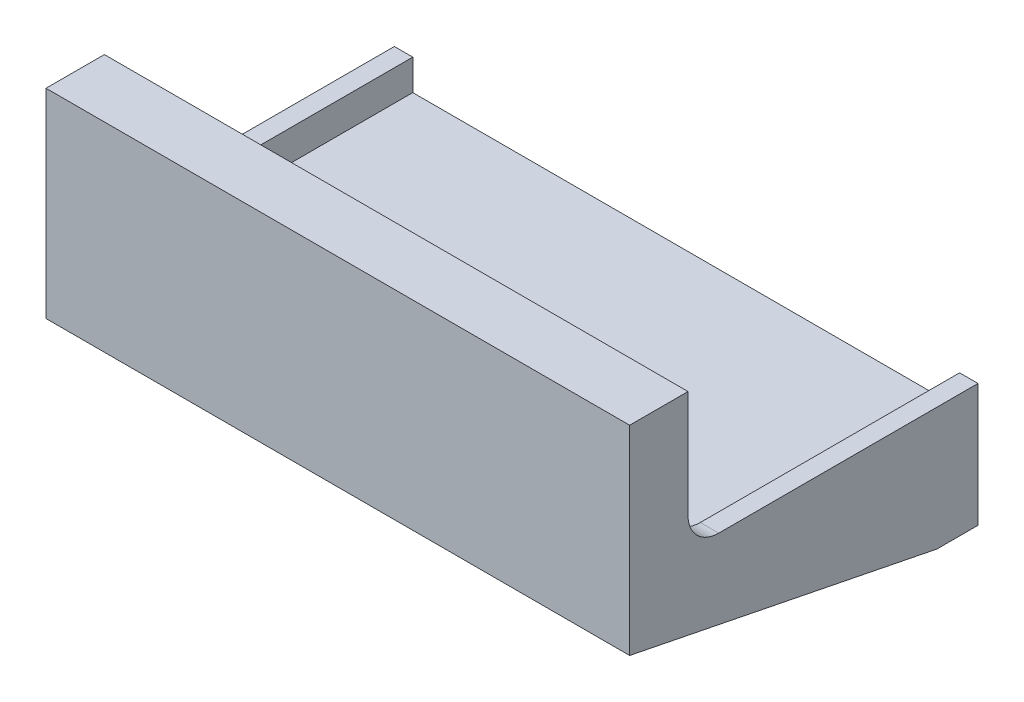
ISO-10303-21;
HEADER;
FILE_DESCRIPTION(('STEP AP214'),'2;1');
FILE_NAME('part.step','',(''),(''),'','','');
FILE_SCHEMA(('AUTOMOTIVE_DESIGN { 1 0 10303 214 1 1 1 1 }'));
ENDSEC;
DATA;
#1=APPLICATION_CONTEXT('core data for automotive mechanical design processes');
#2=APPLICATION_PROTOCOL_DEFINITION('international standard','automotive_design',2000,#1);
#3=PRODUCT_CONTEXT('',#1,'mechanical');
#4=PRODUCT('Part','Part','',(#3));
#5=PRODUCT_RELATED_PRODUCT_CATEGORY('part','',(#4));
#6=PRODUCT_DEFINITION_FORMATION('','',#4);
#7=PRODUCT_DEFINITION_CONTEXT('part definition',#1,'design');
#8=PRODUCT_DEFINITION('design','',#6,#7);
#9=PRODUCT_DEFINITION_SHAPE('','',#8);
#10=(LENGTH_UNIT() NAMED_UNIT(*) SI_UNIT(.MILLI.,.METRE.));
#11=(NAMED_UNIT(*) PLANE_ANGLE_UNIT() SI_UNIT($,.RADIAN.));
#12=(NAMED_UNIT(*) SI_UNIT($,.STERADIAN.) SOLID_ANGLE_UNIT());
#13=UNCERTAINTY_MEASURE_WITH_UNIT(LENGTH_MEASURE(1.E-05),#10,'distance_accuracy_value','');
#14=(GEOMETRIC_REPRESENTATION_CONTEXT(3) GLOBAL_UNCERTAINTY_ASSIGNED_CONTEXT((#13)) GLOBAL_UNIT_ASSIGNED_CONTEXT((#10,
#11,#12)) REPRESENTATION_CONTEXT('',''));
#15=CARTESIAN_POINT('',(0.,0.,0.));
#16=DIRECTION('',(0.,0.,1.));
#17=DIRECTION('',(1.,0.,0.));
#18=AXIS2_PLACEMENT_3D('',#15,#16,#17);
#19=CARTESIAN_POINT('',(-60.5,20.,150.782439194738));
#20=DIRECTION('',(0.,-1.,0.));
#21=DIRECTION('',(0.,0.,-1.));
#22=AXIS2_PLACEMENT_3D('',#19,#20,#21);
#23=PLANE('',#22);
#24=DIRECTION('',(0.,0.,-1.));
#25=VECTOR('',#24,1.);
#26=CARTESIAN_POINT('',(-152.5,20.,150.782439194738));
#27=LINE('',#26,#25);
#28=CARTESIAN_POINT('',(-152.5,20.,42.2));
#29=VERTEX_POINT('',#28);
#30=CARTESIAN_POINT('',(-152.5,20.,0.));
#31=VERTEX_POINT('',#30);
#32=EDGE_CURVE('E252',#29,#31,#27,.T.);
#33=ORIENTED_EDGE('',*,*,#32,.F.);
#34=DIRECTION('',(-1.,0.,0.));
#35=VECTOR('',#34,1.);
#36=CARTESIAN_POINT('',(-60.5,20.,42.2));
#37=LINE('',#36,#35);
#38=CARTESIAN_POINT('',(-149.5,20.,42.2));
#39=VERTEX_POINT('',#38);
#40=EDGE_CURVE('E273',#29,#39,#37,.F.);
#41=ORIENTED_EDGE('',*,*,#40,.T.);
#42=DIRECTION('',(0.,0.,-1.));
#43=VECTOR('',#42,1.);
#44=CARTESIAN_POINT('',(-149.5,20.,150.782439194738));
#45=LINE('',#44,#43);
#46=CARTESIAN_POINT('',(-149.5,20.,0.));
#47=VERTEX_POINT('',#46);
#48=EDGE_CURVE('E254',#39,#47,#45,.T.);
#49=ORIENTED_EDGE('',*,*,#48,.T.);
#50=DIRECTION('',(-1.,0.,0.));
#51=VECTOR('',#50,1.);
#52=CARTESIAN_POINT('',(-152.5,20.,0.));
#53=LINE('',#52,#51);
#54=EDGE_CURVE('E224',#47,#31,#53,.T.);
#55=ORIENTED_EDGE('',*,*,#54,.T.);
#56=EDGE_LOOP('',(#33,#41,#49,#55));
#57=FACE_BOUND('',#56,.T.);
#58=ADVANCED_FACE('F43',(#57),#23,.F.);
#59=CARTESIAN_POINT('',(0.,0.,0.));
#60=DIRECTION('',(0.,0.,1.));
#61=DIRECTION('',(1.,0.,0.));
#62=AXIS2_PLACEMENT_3D('',#59,#60,#61);
#63=PLANE('',#62);
#64=CARTESIAN_POINT('',(-70.,5.6,0.));
#65=DIRECTION('',(0.,0.,-1.));
#66=DIRECTION('',(-1.,0.,0.));
#67=AXIS2_PLACEMENT_3D('',#64,#65,#66);
#68=CIRCLE('',#67,1.59999999999999);
#69=CARTESIAN_POINT('',(-71.6,5.6,0.));
#70=VERTEX_POINT('',#69);
#71=EDGE_CURVE('E163',#70,#70,#68,.T.);
#72=ORIENTED_EDGE('',*,*,#71,.F.);
#73=EDGE_LOOP('',(#72));
#74=FACE_BOUND('',#73,.T.);
#75=CARTESIAN_POINT('',(-140.,5.59999999999998,0.));
#76=DIRECTION('',(0.,0.,-1.));
#77=DIRECTION('',(-1.,0.,0.));
#78=AXIS2_PLACEMENT_3D('',#75,#76,#77);
#79=CIRCLE('',#78,1.59999999999999);
#80=CARTESIAN_POINT('',(-141.6,5.59999999999998,0.));
#81=VERTEX_POINT('',#80);
#82=EDGE_CURVE('E162',#81,#81,#79,.T.);
#83=ORIENTED_EDGE('',*,*,#82,.F.);
#84=EDGE_LOOP('',(#83));
#85=FACE_BOUND('',#84,.T.);
#86=DIRECTION('',(-1.,0.,0.));
#87=VECTOR('',#86,1.);
#88=CARTESIAN_POINT('',(-60.5,15.,0.));
#89=LINE('',#88,#87);
#90=CARTESIAN_POINT('',(-60.5,15.,0.));
#91=VERTEX_POINT('',#90);
#92=CARTESIAN_POINT('',(-149.5,15.,0.));
#93=VERTEX_POINT('',#92);
#94=EDGE_CURVE('E210',#91,#93,#89,.T.);
#95=ORIENTED_EDGE('',*,*,#94,.F.);
#96=DIRECTION('',(0.,-1.,0.));
#97=VECTOR('',#96,1.);
#98=CARTESIAN_POINT('',(-60.5,15.,0.));
#99=LINE('',#98,#97);
#100=CARTESIAN_POINT('',(-60.5,20.,0.));
#101=VERTEX_POINT('',#100);
#102=EDGE_CURVE('E239',#101,#91,#99,.T.);
#103=ORIENTED_EDGE('',*,*,#102,.F.);
#104=DIRECTION('',(-1.,0.,0.));
#105=VECTOR('',#104,1.);
#106=CARTESIAN_POINT('',(-60.5,20.,0.));
#107=LINE('',#106,#105);
#108=CARTESIAN_POINT('',(-57.5,20.,0.));
#109=VERTEX_POINT('',#108);
#110=EDGE_CURVE('E236',#109,#101,#107,.T.);
#111=ORIENTED_EDGE('',*,*,#110,.F.);
#112=DIRECTION('',(0.,1.,0.));
#113=VECTOR('',#112,1.);
#114=CARTESIAN_POINT('',(-57.5,20.,0.));
#115=LINE('',#114,#113);
#116=CARTESIAN_POINT('',(-57.5,0.,0.));
#117=VERTEX_POINT('',#116);
#118=EDGE_CURVE('E233',#117,#109,#115,.T.);
#119=ORIENTED_EDGE('',*,*,#118,.F.);
#120=DIRECTION('',(1.,0.,0.));
#121=VECTOR('',#120,1.);
#122=CARTESIAN_POINT('',(-57.5,0.,0.));
#123=LINE('',#122,#121);
#124=CARTESIAN_POINT('',(-152.5,0.,0.));
#125=VERTEX_POINT('',#124);
#126=EDGE_CURVE('E230',#125,#117,#123,.T.);
#127=ORIENTED_EDGE('',*,*,#126,.F.);
#128=DIRECTION('',(0.,-1.,0.));
#129=VECTOR('',#128,1.);
#130=CARTESIAN_POINT('',(-152.5,0.,0.));
#131=LINE('',#130,#129);
#132=EDGE_CURVE('E227',#31,#125,#131,.T.);
#133=ORIENTED_EDGE('',*,*,#132,.F.);
#134=ORIENTED_EDGE('',*,*,#54,.F.);
#135=DIRECTION('',(0.,1.,0.));
#136=VECTOR('',#135,1.);
#137=CARTESIAN_POINT('',(-149.5,20.,0.));
#138=LINE('',#137,#136);
#139=EDGE_CURVE('E221',#93,#47,#138,.T.);
#140=ORIENTED_EDGE('',*,*,#139,.F.);
#141=EDGE_LOOP('',(#95,#103,#111,#119,#127,#133,#134,#140));
#142=FACE_BOUND('',#141,.T.);
#143=ADVANCED_FACE('F305',(#74,#85,#142),#63,.F.);
#144=CARTESIAN_POINT('',(-60.5,15.,150.782439194738));
#145=DIRECTION('',(1.,0.,0.));
#146=DIRECTION('',(0.,1.,0.));
#147=AXIS2_PLACEMENT_3D('',#144,#145,#146);
#148=PLANE('',#147);
#149=DIRECTION('',(0.,0.,-1.));
#150=VECTOR('',#149,1.);
#151=CARTESIAN_POINT('',(-60.5,15.,150.782439194738));
#152=LINE('',#151,#150);
#153=CARTESIAN_POINT('',(-60.5,15.,53.2));
#154=VERTEX_POINT('',#153);
#155=EDGE_CURVE('E242',#154,#91,#152,.T.);
#156=ORIENTED_EDGE('',*,*,#155,.F.);
#157=DIRECTION('',(0.,1.,0.));
#158=VECTOR('',#157,1.);
#159=CARTESIAN_POINT('',(-60.5,15.,53.2));
#160=LINE('',#159,#158);
#161=CARTESIAN_POINT('',(-60.5,39.,53.2));
#162=VERTEX_POINT('',#161);
#163=EDGE_CURVE('E215',#154,#162,#160,.T.);
#164=ORIENTED_EDGE('',*,*,#163,.T.);
#165=DIRECTION('',(0.,0.,1.));
#166=VECTOR('',#165,1.);
#167=CARTESIAN_POINT('',(-60.5,39.,47.2));
#168=LINE('',#167,#166);
#169=CARTESIAN_POINT('',(-60.5,39.,47.2));
#170=VERTEX_POINT('',#169);
#171=EDGE_CURVE('E191',#170,#162,#168,.T.);
#172=ORIENTED_EDGE('',*,*,#171,.F.);
#173=DIRECTION('',(0.,-1.,0.));
#174=VECTOR('',#173,1.);
#175=CARTESIAN_POINT('',(-60.5,0.,47.2));
#176=LINE('',#175,#174);
#177=CARTESIAN_POINT('',(-60.5,25.,47.2));
#178=VERTEX_POINT('',#177);
#179=EDGE_CURVE('E179',#170,#178,#176,.T.);
#180=ORIENTED_EDGE('',*,*,#179,.T.);
#181=CARTESIAN_POINT('',(-60.4999999999999,25.,42.2));
#182=DIRECTION('',(1.,0.,0.));
#183=DIRECTION('',(0.,1.,0.));
#184=AXIS2_PLACEMENT_3D('',#181,#182,#183);
#185=CIRCLE('',#184,5.);
#186=CARTESIAN_POINT('',(-60.5,20.,42.2));
#187=VERTEX_POINT('',#186);
#188=EDGE_CURVE('E51',#178,#187,#185,.T.);
#189=ORIENTED_EDGE('',*,*,#188,.T.);
#190=DIRECTION('',(0.,0.,-1.));
#191=VECTOR('',#190,1.);
#192=CARTESIAN_POINT('',(-60.5,20.,150.782439194738));
#193=LINE('',#192,#191);
#194=EDGE_CURVE('E244',#187,#101,#193,.T.);
#195=ORIENTED_EDGE('',*,*,#194,.T.);
#196=ORIENTED_EDGE('',*,*,#102,.T.);
#197=EDGE_LOOP('',(#156,#164,#172,#180,#189,#195,#196));
#198=FACE_BOUND('',#197,.T.);
#199=ADVANCED_FACE('F333',(#198),#148,.F.);
#200=ORIENTED_EDGE('',*,*,#194,.F.);
#201=DIRECTION('',(-1.,0.,0.));
#202=VECTOR('',#201,1.);
#203=CARTESIAN_POINT('',(-60.5,20.,42.2));
#204=LINE('',#203,#202);
#205=CARTESIAN_POINT('',(-57.5,20.,42.2));
#206=VERTEX_POINT('',#205);
#207=EDGE_CURVE('E58',#187,#206,#204,.F.);
#208=ORIENTED_EDGE('',*,*,#207,.T.);
#209=DIRECTION('',(0.,0.,-1.));
#210=VECTOR('',#209,1.);
#211=CARTESIAN_POINT('',(-57.5,20.,150.782439194738));
#212=LINE('',#211,#210);
#213=EDGE_CURVE('E246',#206,#109,#212,.T.);
#214=ORIENTED_EDGE('',*,*,#213,.T.);
#215=ORIENTED_EDGE('',*,*,#110,.T.);
#216=EDGE_LOOP('',(#200,#208,#214,#215));
#217=FACE_BOUND('',#216,.T.);
#218=ADVANCED_FACE('F330',(#217),#23,.F.);
#219=CARTESIAN_POINT('',(-57.5,20.,150.782439194738));
#220=DIRECTION('',(-1.,0.,0.));
#221=DIRECTION('',(0.,0.,1.));
#222=AXIS2_PLACEMENT_3D('',#219,#220,#221);
#223=PLANE('',#222);
#224=ORIENTED_EDGE('',*,*,#213,.F.);
#225=CARTESIAN_POINT('',(-57.5,25.,42.2));
#226=DIRECTION('',(-1.,0.,0.));
#227=DIRECTION('',(0.,0.,1.));
#228=AXIS2_PLACEMENT_3D('',#225,#226,#227);
#229=CIRCLE('',#228,5.);
#230=CARTESIAN_POINT('',(-57.5,25.,47.2));
#231=VERTEX_POINT('',#230);
#232=EDGE_CURVE('E11',#206,#231,#229,.T.);
#233=ORIENTED_EDGE('',*,*,#232,.T.);
#234=DIRECTION('',(0.,1.,0.));
#235=VECTOR('',#234,1.);
#236=CARTESIAN_POINT('',(-57.5,0.,47.2));
#237=LINE('',#236,#235);
#238=CARTESIAN_POINT('',(-57.5,42.4638422961661,47.2));
#239=VERTEX_POINT('',#238);
#240=EDGE_CURVE('E181',#231,#239,#237,.T.);
#241=ORIENTED_EDGE('',*,*,#240,.T.);
#242=DIRECTION('',(0.,0.,1.));
#243=VECTOR('',#242,1.);
#244=CARTESIAN_POINT('',(-57.5,42.4638422961661,-44.419794154193));
#245=LINE('',#244,#243);
#246=CARTESIAN_POINT('',(-57.5,42.4638422961661,56.7));
#247=VERTEX_POINT('',#246);
#248=EDGE_CURVE('E199',#239,#247,#245,.T.);
#249=ORIENTED_EDGE('',*,*,#248,.T.);
#250=DIRECTION('',(0.,1.,0.));
#251=VECTOR('',#250,1.);
#252=CARTESIAN_POINT('',(-57.5,20.,56.7));
#253=LINE('',#252,#251);
#254=CARTESIAN_POINT('',(-57.5,10.,56.7));
#255=VERTEX_POINT('',#254);
#256=EDGE_CURVE('E208',#255,#247,#253,.T.);
#257=ORIENTED_EDGE('',*,*,#256,.F.);
#258=DIRECTION('',(0.,-0.196116135138181,-0.980580675690921));
#259=VECTOR('',#258,1.);
#260=CARTESIAN_POINT('',(-57.5,10.,56.7));
#261=LINE('',#260,#259);
#262=CARTESIAN_POINT('',(-57.5,0.,6.69999999999907));
#263=VERTEX_POINT('',#262);
#264=EDGE_CURVE('E261',#255,#263,#261,.T.);
#265=ORIENTED_EDGE('',*,*,#264,.T.);
#266=DIRECTION('',(0.,0.,-1.));
#267=VECTOR('',#266,1.);
#268=CARTESIAN_POINT('',(-57.5,0.,150.782439194738));
#269=LINE('',#268,#267);
#270=EDGE_CURVE('E248',#263,#117,#269,.T.);
#271=ORIENTED_EDGE('',*,*,#270,.T.);
#272=ORIENTED_EDGE('',*,*,#118,.T.);
#273=EDGE_LOOP('',(#224,#233,#241,#249,#257,#265,#271,#272));
#274=FACE_BOUND('',#273,.T.);
#275=ADVANCED_FACE('F319',(#274),#223,.F.);
#276=CARTESIAN_POINT('',(-57.5,0.,150.782439194738));
#277=DIRECTION('',(0.,1.,0.));
#278=DIRECTION('',(-1.,0.,0.));
#279=AXIS2_PLACEMENT_3D('',#276,#277,#278);
#280=PLANE('',#279);
#281=ORIENTED_EDGE('',*,*,#270,.F.);
#282=DIRECTION('',(-1.,0.,0.));
#283=VECTOR('',#282,1.);
#284=CARTESIAN_POINT('',(-152.5,0.,6.69999999999908));
#285=LINE('',#284,#283);
#286=CARTESIAN_POINT('',(-152.5,0.,6.69999999999907));
#287=VERTEX_POINT('',#286);
#288=EDGE_CURVE('E263',#263,#287,#285,.T.);
#289=ORIENTED_EDGE('',*,*,#288,.T.);
#290=DIRECTION('',(0.,0.,-1.));
#291=VECTOR('',#290,1.);
#292=CARTESIAN_POINT('',(-152.5,0.,150.782439194738));
#293=LINE('',#292,#291);
#294=EDGE_CURVE('E250',#287,#125,#293,.T.);
#295=ORIENTED_EDGE('',*,*,#294,.T.);
#296=ORIENTED_EDGE('',*,*,#126,.T.);
#297=EDGE_LOOP('',(#281,#289,#295,#296));
#298=FACE_BOUND('',#297,.T.);
#299=ADVANCED_FACE('F364',(#298),#280,.F.);
#300=CARTESIAN_POINT('',(-152.5,0.,150.782439194738));
#301=DIRECTION('',(1.,0.,0.));
#302=DIRECTION('',(0.,0.,-1.));
#303=AXIS2_PLACEMENT_3D('',#300,#301,#302);
#304=PLANE('',#303);
#305=DIRECTION('',(0.,1.,0.));
#306=VECTOR('',#305,1.);
#307=CARTESIAN_POINT('',(-152.5,0.,47.2));
#308=LINE('',#307,#306);
#309=CARTESIAN_POINT('',(-152.5,25.,47.2));
#310=VERTEX_POINT('',#309);
#311=CARTESIAN_POINT('',(-152.5,42.4638422961661,47.2));
#312=VERTEX_POINT('',#311);
#313=EDGE_CURVE('E186',#310,#312,#308,.T.);
#314=ORIENTED_EDGE('',*,*,#313,.F.);
#315=CARTESIAN_POINT('',(-152.5,25.,42.2));
#316=DIRECTION('',(1.,0.,0.));
#317=DIRECTION('',(0.,0.,-1.));
#318=AXIS2_PLACEMENT_3D('',#315,#316,#317);
#319=CIRCLE('',#318,5.);
#320=EDGE_CURVE('E276',#310,#29,#319,.T.);
#321=ORIENTED_EDGE('',*,*,#320,.T.);
#322=ORIENTED_EDGE('',*,*,#32,.T.);
#323=ORIENTED_EDGE('',*,*,#132,.T.);
#324=ORIENTED_EDGE('',*,*,#294,.F.);
#325=DIRECTION('',(0.,0.196116135138181,0.980580675690921));
#326=VECTOR('',#325,1.);
#327=CARTESIAN_POINT('',(-152.5,10.,56.7));
#328=LINE('',#327,#326);
#329=CARTESIAN_POINT('',(-152.5,10.,56.7));
#330=VERTEX_POINT('',#329);
#331=EDGE_CURVE('E265',#287,#330,#328,.T.);
#332=ORIENTED_EDGE('',*,*,#331,.T.);
#333=DIRECTION('',(0.,-1.,0.));
#334=VECTOR('',#333,1.);
#335=CARTESIAN_POINT('',(-152.5,20.,56.7));
#336=LINE('',#335,#334);
#337=CARTESIAN_POINT('',(-152.5,42.4638422961661,56.7));
#338=VERTEX_POINT('',#337);
#339=EDGE_CURVE('E203',#338,#330,#336,.T.);
#340=ORIENTED_EDGE('',*,*,#339,.F.);
#341=DIRECTION('',(0.,0.,1.));
#342=VECTOR('',#341,1.);
#343=CARTESIAN_POINT('',(-152.5,42.4638422961661,-44.419794154193));
#344=LINE('',#343,#342);
#345=EDGE_CURVE('E200',#312,#338,#344,.T.);
#346=ORIENTED_EDGE('',*,*,#345,.F.);
#347=EDGE_LOOP('',(#314,#321,#322,#323,#324,#332,#340,#346));
#348=FACE_BOUND('',#347,.T.);
#349=ADVANCED_FACE('F296',(#348),#304,.F.);
#350=CARTESIAN_POINT('',(-149.5,20.,150.782439194738));
#351=DIRECTION('',(-1.,0.,0.));
#352=DIRECTION('',(0.,-1.,0.));
#353=AXIS2_PLACEMENT_3D('',#350,#351,#352);
#354=PLANE('',#353);
#355=ORIENTED_EDGE('',*,*,#48,.F.);
#356=CARTESIAN_POINT('',(-149.5,25.,42.2));
#357=DIRECTION('',(-1.,0.,0.));
#358=DIRECTION('',(0.,-1.,0.));
#359=AXIS2_PLACEMENT_3D('',#356,#357,#358);
#360=CIRCLE('',#359,5.);
#361=CARTESIAN_POINT('',(-149.5,25.,47.2));
#362=VERTEX_POINT('',#361);
#363=EDGE_CURVE('E278',#39,#362,#360,.T.);
#364=ORIENTED_EDGE('',*,*,#363,.T.);
#365=DIRECTION('',(0.,1.,0.));
#366=VECTOR('',#365,1.);
#367=CARTESIAN_POINT('',(-149.5,0.,47.2));
#368=LINE('',#367,#366);
#369=CARTESIAN_POINT('',(-149.5,39.,47.2));
#370=VERTEX_POINT('',#369);
#371=EDGE_CURVE('E174',#362,#370,#368,.T.);
#372=ORIENTED_EDGE('',*,*,#371,.T.);
#373=DIRECTION('',(0.,0.,1.));
#374=VECTOR('',#373,1.);
#375=CARTESIAN_POINT('',(-149.5,39.,47.2));
#376=LINE('',#375,#374);
#377=CARTESIAN_POINT('',(-149.5,39.,53.2));
#378=VERTEX_POINT('',#377);
#379=EDGE_CURVE('E188',#370,#378,#376,.T.);
#380=ORIENTED_EDGE('',*,*,#379,.T.);
#381=DIRECTION('',(0.,-1.,0.));
#382=VECTOR('',#381,1.);
#383=CARTESIAN_POINT('',(-149.5,20.,53.2));
#384=LINE('',#383,#382);
#385=CARTESIAN_POINT('',(-149.5,15.,53.2));
#386=VERTEX_POINT('',#385);
#387=EDGE_CURVE('E211',#378,#386,#384,.T.);
#388=ORIENTED_EDGE('',*,*,#387,.T.);
#389=DIRECTION('',(0.,0.,-1.));
#390=VECTOR('',#389,1.);
#391=CARTESIAN_POINT('',(-149.5,15.,150.782439194738));
#392=LINE('',#391,#390);
#393=EDGE_CURVE('E256',#386,#93,#392,.T.);
#394=ORIENTED_EDGE('',*,*,#393,.T.);
#395=ORIENTED_EDGE('',*,*,#139,.T.);
#396=EDGE_LOOP('',(#355,#364,#372,#380,#388,#394,#395));
#397=FACE_BOUND('',#396,.T.);
#398=ADVANCED_FACE('F283',(#397),#354,.F.);
#399=CARTESIAN_POINT('',(-60.5,15.,150.782439194738));
#400=DIRECTION('',(0.,-1.,0.));
#401=DIRECTION('',(1.,0.,0.));
#402=AXIS2_PLACEMENT_3D('',#399,#400,#401);
#403=PLANE('',#402);
#404=ORIENTED_EDGE('',*,*,#393,.F.);
#405=DIRECTION('',(1.,0.,0.));
#406=VECTOR('',#405,1.);
#407=CARTESIAN_POINT('',(-60.5,15.,53.2));
#408=LINE('',#407,#406);
#409=EDGE_CURVE('E214',#386,#154,#408,.T.);
#410=ORIENTED_EDGE('',*,*,#409,.T.);
#411=ORIENTED_EDGE('',*,*,#155,.T.);
#412=ORIENTED_EDGE('',*,*,#94,.T.);
#413=EDGE_LOOP('',(#404,#410,#411,#412));
#414=FACE_BOUND('',#413,.T.);
#415=ADVANCED_FACE('F336',(#414),#403,.F.);
#416=CARTESIAN_POINT('',(0.,0.,56.7));
#417=DIRECTION('',(0.,0.,1.));
#418=DIRECTION('',(1.,0.,0.));
#419=AXIS2_PLACEMENT_3D('',#416,#417,#418);
#420=PLANE('',#419);
#421=ORIENTED_EDGE('',*,*,#339,.T.);
#422=DIRECTION('',(1.,0.,0.));
#423=VECTOR('',#422,1.);
#424=CARTESIAN_POINT('',(-57.5,10.,56.7));
#425=LINE('',#424,#423);
#426=EDGE_CURVE('E218',#330,#255,#425,.T.);
#427=ORIENTED_EDGE('',*,*,#426,.T.);
#428=ORIENTED_EDGE('',*,*,#256,.T.);
#429=DIRECTION('',(1.,0.,0.));
#430=VECTOR('',#429,1.);
#431=CARTESIAN_POINT('',(0.,42.4638422961661,56.7));
#432=LINE('',#431,#430);
#433=EDGE_CURVE('E194',#338,#247,#432,.T.);
#434=ORIENTED_EDGE('',*,*,#433,.F.);
#435=EDGE_LOOP('',(#421,#427,#428,#434));
#436=FACE_BOUND('',#435,.T.);
#437=ADVANCED_FACE('F316',(#436),#420,.T.);
#438=CARTESIAN_POINT('',(0.,0.,53.2));
#439=DIRECTION('',(0.,0.,1.));
#440=DIRECTION('',(1.,0.,0.));
#441=AXIS2_PLACEMENT_3D('',#438,#439,#440);
#442=PLANE('',#441);
#443=ORIENTED_EDGE('',*,*,#387,.F.);
#444=DIRECTION('',(1.,0.,0.));
#445=VECTOR('',#444,1.);
#446=CARTESIAN_POINT('',(0.,39.,53.2));
#447=LINE('',#446,#445);
#448=EDGE_CURVE('E173',#378,#162,#447,.T.);
#449=ORIENTED_EDGE('',*,*,#448,.T.);
#450=ORIENTED_EDGE('',*,*,#163,.F.);
#451=ORIENTED_EDGE('',*,*,#409,.F.);
#452=EDGE_LOOP('',(#443,#449,#450,#451));
#453=FACE_BOUND('',#452,.T.);
#454=ADVANCED_FACE('F338',(#453),#442,.F.);
#455=CARTESIAN_POINT('',(0.,10.,56.7));
#456=DIRECTION('',(0.,-0.980580675690921,0.196116135138181));
#457=DIRECTION('',(-1.,0.,0.));
#458=AXIS2_PLACEMENT_3D('',#455,#456,#457);
#459=PLANE('',#458);
#460=ORIENTED_EDGE('',*,*,#331,.F.);
#461=ORIENTED_EDGE('',*,*,#288,.F.);
#462=ORIENTED_EDGE('',*,*,#264,.F.);
#463=ORIENTED_EDGE('',*,*,#426,.F.);
#464=EDGE_LOOP('',(#460,#461,#462,#463));
#465=FACE_BOUND('',#464,.T.);
#466=ADVANCED_FACE('F313',(#465),#459,.T.);
#467=CARTESIAN_POINT('',(0.,42.4638422961661,-44.419794154193));
#468=DIRECTION('',(0.,-1.,0.));
#469=DIRECTION('',(0.,0.,-1.));
#470=AXIS2_PLACEMENT_3D('',#467,#468,#469);
#471=PLANE('',#470);
#472=ORIENTED_EDGE('',*,*,#248,.F.);
#473=DIRECTION('',(1.,0.,0.));
#474=VECTOR('',#473,1.);
#475=CARTESIAN_POINT('',(0.,42.4638422961661,47.2));
#476=LINE('',#475,#474);
#477=EDGE_CURVE('E183',#312,#239,#476,.T.);
#478=ORIENTED_EDGE('',*,*,#477,.F.);
#479=ORIENTED_EDGE('',*,*,#345,.T.);
#480=ORIENTED_EDGE('',*,*,#433,.T.);
#481=EDGE_LOOP('',(#472,#478,#479,#480));
#482=FACE_BOUND('',#481,.T.);
#483=ADVANCED_FACE('F325',(#482),#471,.F.);
#484=CARTESIAN_POINT('',(0.,39.,47.2));
#485=DIRECTION('',(0.,-1.,0.));
#486=DIRECTION('',(0.,0.,-1.));
#487=AXIS2_PLACEMENT_3D('',#484,#485,#486);
#488=PLANE('',#487);
#489=ORIENTED_EDGE('',*,*,#448,.F.);
#490=ORIENTED_EDGE('',*,*,#379,.F.);
#491=DIRECTION('',(1.,0.,0.));
#492=VECTOR('',#491,1.);
#493=CARTESIAN_POINT('',(0.,39.,47.2));
#494=LINE('',#493,#492);
#495=EDGE_CURVE('E176',#370,#170,#494,.T.);
#496=ORIENTED_EDGE('',*,*,#495,.T.);
#497=ORIENTED_EDGE('',*,*,#171,.T.);
#498=EDGE_LOOP('',(#489,#490,#496,#497));
#499=FACE_BOUND('',#498,.T.);
#500=ADVANCED_FACE('F341',(#499),#488,.T.);
#501=CARTESIAN_POINT('',(0.,0.,47.2));
#502=DIRECTION('',(0.,0.,-1.));
#503=DIRECTION('',(-1.,0.,0.));
#504=AXIS2_PLACEMENT_3D('',#501,#502,#503);
#505=PLANE('',#504);
#506=ORIENTED_EDGE('',*,*,#371,.F.);
#507=DIRECTION('',(-1.,0.,0.));
#508=VECTOR('',#507,1.);
#509=CARTESIAN_POINT('',(0.,25.,47.2));
#510=LINE('',#509,#508);
#511=EDGE_CURVE('E270',#362,#310,#510,.T.);
#512=ORIENTED_EDGE('',*,*,#511,.T.);
#513=ORIENTED_EDGE('',*,*,#313,.T.);
#514=ORIENTED_EDGE('',*,*,#477,.T.);
#515=ORIENTED_EDGE('',*,*,#240,.F.);
#516=DIRECTION('',(-1.,0.,0.));
#517=VECTOR('',#516,1.);
#518=CARTESIAN_POINT('',(0.,25.,47.2));
#519=LINE('',#518,#517);
#520=EDGE_CURVE('E267',#231,#178,#519,.T.);
#521=ORIENTED_EDGE('',*,*,#520,.T.);
#522=ORIENTED_EDGE('',*,*,#179,.F.);
#523=ORIENTED_EDGE('',*,*,#495,.F.);
#524=EDGE_LOOP('',(#506,#512,#513,#514,#515,#521,#522,#523));
#525=FACE_BOUND('',#524,.T.);
#526=ADVANCED_FACE('F290',(#525),#505,.T.);
#527=CARTESIAN_POINT('',(0.,25.,42.2));
#528=DIRECTION('',(-1.,0.,0.));
#529=DIRECTION('',(0.,0.,1.));
#530=AXIS2_PLACEMENT_3D('',#527,#528,#529);
#531=CYLINDRICAL_SURFACE('',#530,5.);
#532=ORIENTED_EDGE('',*,*,#363,.F.);
#533=ORIENTED_EDGE('',*,*,#40,.F.);
#534=ORIENTED_EDGE('',*,*,#320,.F.);
#535=ORIENTED_EDGE('',*,*,#511,.F.);
#536=EDGE_LOOP('',(#532,#533,#534,#535));
#537=FACE_BOUND('',#536,.T.);
#538=ADVANCED_FACE('F293',(#537),#531,.F.);
#539=CARTESIAN_POINT('',(0.,25.,42.2));
#540=DIRECTION('',(-1.,0.,0.));
#541=DIRECTION('',(0.,0.,1.));
#542=AXIS2_PLACEMENT_3D('',#539,#540,#541);
#543=CYLINDRICAL_SURFACE('',#542,5.);
#544=ORIENTED_EDGE('',*,*,#232,.F.);
#545=ORIENTED_EDGE('',*,*,#207,.F.);
#546=ORIENTED_EDGE('',*,*,#188,.F.);
#547=ORIENTED_EDGE('',*,*,#520,.F.);
#548=EDGE_LOOP('',(#544,#545,#546,#547));
#549=FACE_BOUND('',#548,.T.);
#550=ADVANCED_FACE('F45',(#549),#543,.F.);
#551=CARTESIAN_POINT('',(-140.,5.59999999999998,6.50000000000001));
#552=DIRECTION('',(0.,0.,-1.));
#553=DIRECTION('',(-1.,0.,0.));
#554=AXIS2_PLACEMENT_3D('',#551,#552,#553);
#555=CONICAL_SURFACE('',#554,1.59999999999999,1.02974425867665);
#556=CARTESIAN_POINT('',(-140.,5.59999999999998,7.4613769904441));
#557=VERTEX_POINT('',#556);
#558=VERTEX_LOOP('',#557);
#559=FACE_BOUND('',#558,.T.);
#560=CARTESIAN_POINT('',(-140.,5.59999999999998,6.50000000000001));
#561=DIRECTION('',(0.,0.,-1.));
#562=DIRECTION('',(-1.,0.,0.));
#563=AXIS2_PLACEMENT_3D('',#560,#561,#562);
#564=CIRCLE('',#563,1.59999999999999);
#565=CARTESIAN_POINT('',(-141.6,5.59999999999998,6.50000000000001));
#566=VERTEX_POINT('',#565);
#567=EDGE_CURVE('E166',#566,#566,#564,.T.);
#568=ORIENTED_EDGE('',*,*,#567,.T.);
#569=EDGE_LOOP('',(#568));
#570=FACE_BOUND('',#569,.T.);
#571=ADVANCED_FACE('F390',(#559,#570),#555,.F.);
#572=CARTESIAN_POINT('',(-140.,5.59999999999998,0.));
#573=DIRECTION('',(0.,0.,-1.));
#574=DIRECTION('',(-1.,0.,0.));
#575=AXIS2_PLACEMENT_3D('',#572,#573,#574);
#576=CYLINDRICAL_SURFACE('',#575,1.59999999999999);
#577=ORIENTED_EDGE('',*,*,#567,.F.);
#578=EDGE_LOOP('',(#577));
#579=FACE_BOUND('',#578,.T.);
#580=ORIENTED_EDGE('',*,*,#82,.T.);
#581=EDGE_LOOP('',(#580));
#582=FACE_BOUND('',#581,.T.);
#583=ADVANCED_FACE('F156',(#579,#582),#576,.F.);
#584=CARTESIAN_POINT('',(-70.,5.6,6.50000000000001));
#585=DIRECTION('',(0.,0.,-1.));
#586=DIRECTION('',(-1.,0.,0.));
#587=AXIS2_PLACEMENT_3D('',#584,#585,#586);
#588=CONICAL_SURFACE('',#587,1.59999999999999,1.02974425867665);
#589=CARTESIAN_POINT('',(-70.,5.6,7.4613769904441));
#590=VERTEX_POINT('',#589);
#591=VERTEX_LOOP('',#590);
#592=FACE_BOUND('',#591,.T.);
#593=CARTESIAN_POINT('',(-70.,5.6,6.50000000000001));
#594=DIRECTION('',(0.,0.,-1.));
#595=DIRECTION('',(-1.,0.,0.));
#596=AXIS2_PLACEMENT_3D('',#593,#594,#595);
#597=CIRCLE('',#596,1.59999999999999);
#598=CARTESIAN_POINT('',(-71.6,5.6,6.50000000000001));
#599=VERTEX_POINT('',#598);
#600=EDGE_CURVE('E160',#599,#599,#597,.T.);
#601=ORIENTED_EDGE('',*,*,#600,.T.);
#602=EDGE_LOOP('',(#601));
#603=FACE_BOUND('',#602,.T.);
#604=ADVANCED_FACE('F152',(#592,#603),#588,.F.);
#605=CARTESIAN_POINT('',(-70.,5.6,0.));
#606=DIRECTION('',(0.,0.,-1.));
#607=DIRECTION('',(-1.,0.,0.));
#608=AXIS2_PLACEMENT_3D('',#605,#606,#607);
#609=CYLINDRICAL_SURFACE('',#608,1.59999999999999);
#610=ORIENTED_EDGE('',*,*,#600,.F.);
#611=EDGE_LOOP('',(#610));
#612=FACE_BOUND('',#611,.T.);
#613=ORIENTED_EDGE('',*,*,#71,.T.);
#614=EDGE_LOOP('',(#613));
#615=FACE_BOUND('',#614,.T.);
#616=ADVANCED_FACE('F155',(#612,#615),#609,.F.);
#617=CLOSED_SHELL('',(#58,#143,#199,#218,#275,#299,#349,#398,#415,#437,#454,#466,#483,#500,#526,
#538,#550,#571,#583,#604,#616));
#618=MANIFOLD_SOLID_BREP('B2',#617);
#619=ADVANCED_BREP_SHAPE_REPRESENTATION('',(#18,#618),#14);
#620=SHAPE_DEFINITION_REPRESENTATION(#9,#619);
ENDSEC;
END-ISO-10303-21;
